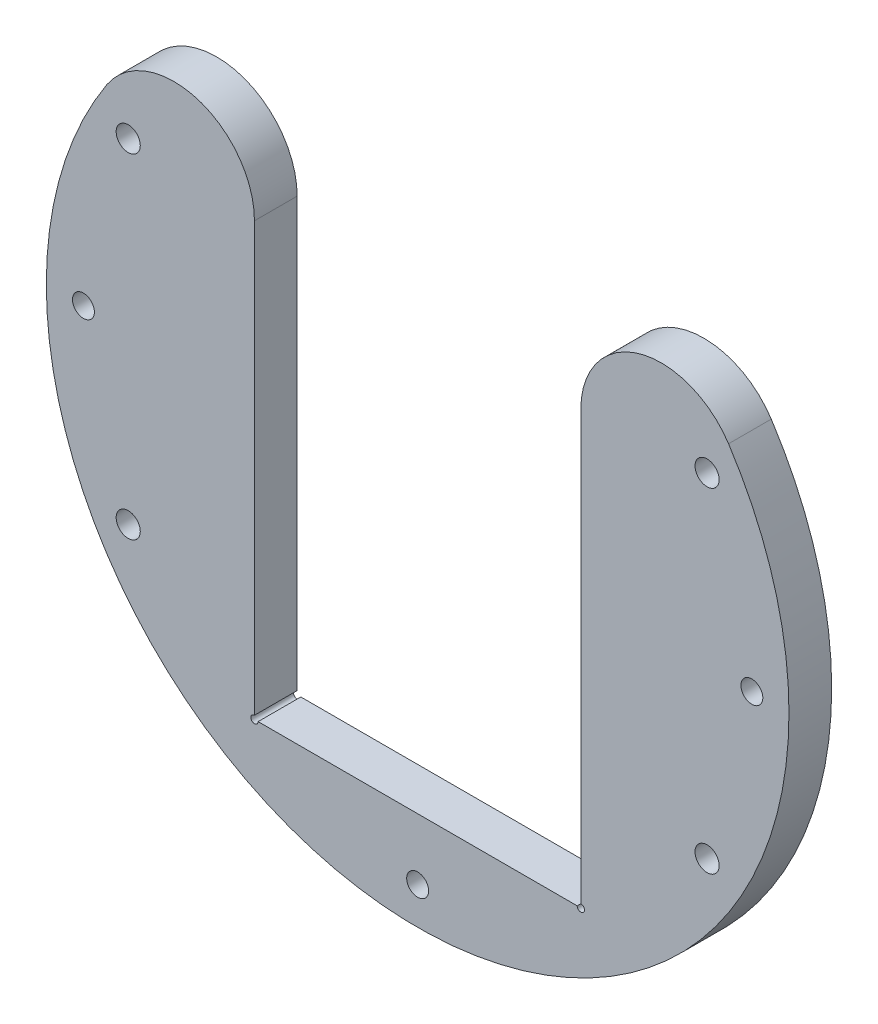
ISO-10303-21;
HEADER;
FILE_DESCRIPTION(('STEP AP214'),'2;1');
FILE_NAME('part.step','',(''),(''),'','','');
FILE_SCHEMA(('AUTOMOTIVE_DESIGN { 1 0 10303 214 1 1 1 1 }'));
ENDSEC;
DATA;
#1=APPLICATION_CONTEXT('core data for automotive mechanical design processes');
#2=APPLICATION_PROTOCOL_DEFINITION('international standard','automotive_design',2000,#1);
#3=PRODUCT_CONTEXT('',#1,'mechanical');
#4=PRODUCT('Part','Part','',(#3));
#5=PRODUCT_RELATED_PRODUCT_CATEGORY('part','',(#4));
#6=PRODUCT_DEFINITION_FORMATION('','',#4);
#7=PRODUCT_DEFINITION_CONTEXT('part definition',#1,'design');
#8=PRODUCT_DEFINITION('design','',#6,#7);
#9=PRODUCT_DEFINITION_SHAPE('','',#8);
#10=(LENGTH_UNIT() NAMED_UNIT(*) SI_UNIT(.MILLI.,.METRE.));
#11=(NAMED_UNIT(*) PLANE_ANGLE_UNIT() SI_UNIT($,.RADIAN.));
#12=(NAMED_UNIT(*) SI_UNIT($,.STERADIAN.) SOLID_ANGLE_UNIT());
#13=UNCERTAINTY_MEASURE_WITH_UNIT(LENGTH_MEASURE(1.E-05),#10,'distance_accuracy_value','');
#14=(GEOMETRIC_REPRESENTATION_CONTEXT(3) GLOBAL_UNCERTAINTY_ASSIGNED_CONTEXT((#13)) GLOBAL_UNIT_ASSIGNED_CONTEXT((#10,
#11,#12)) REPRESENTATION_CONTEXT('',''));
#15=CARTESIAN_POINT('',(0.,0.,0.));
#16=DIRECTION('',(0.,0.,1.));
#17=DIRECTION('',(1.,0.,0.));
#18=AXIS2_PLACEMENT_3D('',#15,#16,#17);
#19=CARTESIAN_POINT('',(-22.325000054,0.,5.842));
#20=DIRECTION('',(-1.,0.,0.));
#21=DIRECTION('',(0.,-1.,0.));
#22=AXIS2_PLACEMENT_3D('',#19,#20,#21);
#23=PLANE('',#22);
#24=DIRECTION('',(0.,1.,0.));
#25=VECTOR('',#24,1.);
#26=CARTESIAN_POINT('',(-22.325000054,0.,5.842));
#27=LINE('',#26,#25);
#28=CARTESIAN_POINT('',(-22.325000054,-36.823,5.842));
#29=VERTEX_POINT('',#28);
#30=CARTESIAN_POINT('',(-22.325000054,21.759696031905,5.842));
#31=VERTEX_POINT('',#30);
#32=EDGE_CURVE('E149',#29,#31,#27,.T.);
#33=ORIENTED_EDGE('',*,*,#32,.F.);
#34=DIRECTION('',(0.,0.,1.));
#35=VECTOR('',#34,1.);
#36=CARTESIAN_POINT('',(-22.325000054,-36.823,0.));
#37=LINE('',#36,#35);
#38=CARTESIAN_POINT('',(-22.325000054,-36.823,0.));
#39=VERTEX_POINT('',#38);
#40=EDGE_CURVE('E178',#29,#39,#37,.F.);
#41=ORIENTED_EDGE('',*,*,#40,.T.);
#42=DIRECTION('',(0.,1.,0.));
#43=VECTOR('',#42,1.);
#44=CARTESIAN_POINT('',(-22.325000054,0.,0.));
#45=LINE('',#44,#43);
#46=CARTESIAN_POINT('',(-22.325000054,21.759696031905,0.));
#47=VERTEX_POINT('',#46);
#48=EDGE_CURVE('E150',#39,#47,#45,.T.);
#49=ORIENTED_EDGE('',*,*,#48,.T.);
#50=DIRECTION('',(0.,0.,-1.));
#51=VECTOR('',#50,1.);
#52=CARTESIAN_POINT('',(-22.325000054,21.759696031905,5.842));
#53=LINE('',#52,#51);
#54=EDGE_CURVE('E142',#47,#31,#53,.F.);
#55=ORIENTED_EDGE('',*,*,#54,.T.);
#56=EDGE_LOOP('',(#33,#41,#49,#55));
#57=FACE_BOUND('',#56,.T.);
#58=ADVANCED_FACE('F35',(#57),#23,.F.);
#59=CARTESIAN_POINT('',(0.,0.,5.842));
#60=DIRECTION('',(0.,0.,-1.));
#61=DIRECTION('',(-1.,0.,0.));
#62=AXIS2_PLACEMENT_3D('',#59,#60,#61);
#63=CYLINDRICAL_SURFACE('',#62,50.8);
#64=CARTESIAN_POINT('',(0.,0.,0.));
#65=DIRECTION('',(0.,0.,1.));
#66=DIRECTION('',(1.,0.,0.));
#67=AXIS2_PLACEMENT_3D('',#64,#65,#66);
#68=CIRCLE('',#67,50.8);
#69=CARTESIAN_POINT('',(-42.535427204603,27.7736823723812,0.));
#70=VERTEX_POINT('',#69);
#71=CARTESIAN_POINT('',(42.535427204603,27.7736823723812,0.));
#72=VERTEX_POINT('',#71);
#73=EDGE_CURVE('E120',#70,#72,#68,.T.);
#74=ORIENTED_EDGE('',*,*,#73,.T.);
#75=DIRECTION('',(0.,0.,-1.));
#76=VECTOR('',#75,1.);
#77=CARTESIAN_POINT('',(42.535427204603,27.7736823723812,5.842));
#78=LINE('',#77,#76);
#79=CARTESIAN_POINT('',(42.535427204603,27.7736823723812,5.842));
#80=VERTEX_POINT('',#79);
#81=EDGE_CURVE('E135',#72,#80,#78,.F.);
#82=ORIENTED_EDGE('',*,*,#81,.T.);
#83=CARTESIAN_POINT('',(0.,0.,5.842));
#84=DIRECTION('',(0.,0.,1.));
#85=DIRECTION('',(1.,0.,0.));
#86=AXIS2_PLACEMENT_3D('',#83,#84,#85);
#87=CIRCLE('',#86,50.8);
#88=CARTESIAN_POINT('',(-42.535427204603,27.7736823723812,5.842));
#89=VERTEX_POINT('',#88);
#90=EDGE_CURVE('E158',#89,#80,#87,.T.);
#91=ORIENTED_EDGE('',*,*,#90,.F.);
#92=DIRECTION('',(0.,0.,-1.));
#93=VECTOR('',#92,1.);
#94=CARTESIAN_POINT('',(-42.535427204603,27.7736823723812,5.842));
#95=LINE('',#94,#93);
#96=EDGE_CURVE('E132',#89,#70,#95,.T.);
#97=ORIENTED_EDGE('',*,*,#96,.T.);
#98=EDGE_LOOP('',(#74,#82,#91,#97));
#99=FACE_BOUND('',#98,.T.);
#100=ADVANCED_FACE('F163',(#99),#63,.T.);
#101=CARTESIAN_POINT('',(22.325000054,0.,5.842));
#102=DIRECTION('',(-1.,0.,0.));
#103=DIRECTION('',(0.,-1.,0.));
#104=AXIS2_PLACEMENT_3D('',#101,#102,#103);
#105=PLANE('',#104);
#106=DIRECTION('',(0.,0.,1.));
#107=VECTOR('',#106,1.);
#108=CARTESIAN_POINT('',(22.325000054,-36.823,0.));
#109=LINE('',#108,#107);
#110=CARTESIAN_POINT('',(22.325000054,-36.823,5.842));
#111=VERTEX_POINT('',#110);
#112=CARTESIAN_POINT('',(22.325000054,-36.823,0.));
#113=VERTEX_POINT('',#112);
#114=EDGE_CURVE('E50',#111,#113,#109,.F.);
#115=ORIENTED_EDGE('',*,*,#114,.F.);
#116=DIRECTION('',(0.,1.,0.));
#117=VECTOR('',#116,1.);
#118=CARTESIAN_POINT('',(22.325000054,0.,5.842));
#119=LINE('',#118,#117);
#120=CARTESIAN_POINT('',(22.325000054,21.7596960319049,5.842));
#121=VERTEX_POINT('',#120);
#122=EDGE_CURVE('E166',#111,#121,#119,.T.);
#123=ORIENTED_EDGE('',*,*,#122,.T.);
#124=DIRECTION('',(0.,0.,1.));
#125=VECTOR('',#124,1.);
#126=CARTESIAN_POINT('',(22.325000054,21.7596960319049,0.));
#127=LINE('',#126,#125);
#128=CARTESIAN_POINT('',(22.325000054,21.7596960319049,0.));
#129=VERTEX_POINT('',#128);
#130=EDGE_CURVE('E124',#121,#129,#127,.F.);
#131=ORIENTED_EDGE('',*,*,#130,.T.);
#132=DIRECTION('',(0.,1.,0.));
#133=VECTOR('',#132,1.);
#134=CARTESIAN_POINT('',(22.325000054,0.,0.));
#135=LINE('',#134,#133);
#136=EDGE_CURVE('E115',#113,#129,#135,.T.);
#137=ORIENTED_EDGE('',*,*,#136,.F.);
#138=EDGE_LOOP('',(#115,#123,#131,#137));
#139=FACE_BOUND('',#138,.T.);
#140=ADVANCED_FACE('F202',(#139),#105,.T.);
#141=CARTESIAN_POINT('',(-45.72,0.,5.842));
#142=DIRECTION('',(0.,0.,-1.));
#143=DIRECTION('',(-1.,0.,0.));
#144=AXIS2_PLACEMENT_3D('',#141,#142,#143);
#145=CYLINDRICAL_SURFACE('',#144,1.5);
#146=CARTESIAN_POINT('',(-45.72,0.,5.842));
#147=DIRECTION('',(0.,0.,1.));
#148=DIRECTION('',(1.,0.,0.));
#149=AXIS2_PLACEMENT_3D('',#146,#147,#148);
#150=CIRCLE('',#149,1.5);
#151=CARTESIAN_POINT('',(-44.22,0.,5.842));
#152=VERTEX_POINT('',#151);
#153=EDGE_CURVE('E169',#152,#152,#150,.T.);
#154=ORIENTED_EDGE('',*,*,#153,.T.);
#155=EDGE_LOOP('',(#154));
#156=FACE_BOUND('',#155,.T.);
#157=CARTESIAN_POINT('',(-45.72,0.,0.));
#158=DIRECTION('',(0.,0.,1.));
#159=DIRECTION('',(1.,0.,0.));
#160=AXIS2_PLACEMENT_3D('',#157,#158,#159);
#161=CIRCLE('',#160,1.5);
#162=CARTESIAN_POINT('',(-44.22,0.,0.));
#163=VERTEX_POINT('',#162);
#164=EDGE_CURVE('E193',#163,#163,#161,.T.);
#165=ORIENTED_EDGE('',*,*,#164,.F.);
#166=EDGE_LOOP('',(#165));
#167=FACE_BOUND('',#166,.T.);
#168=ADVANCED_FACE('F226',(#156,#167),#145,.F.);
#169=CARTESIAN_POINT('',(45.72,0.,5.842));
#170=DIRECTION('',(0.,0.,-1.));
#171=DIRECTION('',(-1.,0.,0.));
#172=AXIS2_PLACEMENT_3D('',#169,#170,#171);
#173=CYLINDRICAL_SURFACE('',#172,1.5);
#174=CARTESIAN_POINT('',(45.72,0.,5.842));
#175=DIRECTION('',(0.,0.,1.));
#176=DIRECTION('',(1.,0.,0.));
#177=AXIS2_PLACEMENT_3D('',#174,#175,#176);
#178=CIRCLE('',#177,1.5);
#179=CARTESIAN_POINT('',(47.22,0.,5.842));
#180=VERTEX_POINT('',#179);
#181=EDGE_CURVE('E221',#180,#180,#178,.T.);
#182=ORIENTED_EDGE('',*,*,#181,.T.);
#183=EDGE_LOOP('',(#182));
#184=FACE_BOUND('',#183,.T.);
#185=CARTESIAN_POINT('',(45.72,0.,0.));
#186=DIRECTION('',(0.,0.,1.));
#187=DIRECTION('',(1.,0.,0.));
#188=AXIS2_PLACEMENT_3D('',#185,#186,#187);
#189=CIRCLE('',#188,1.5);
#190=CARTESIAN_POINT('',(47.22,0.,0.));
#191=VERTEX_POINT('',#190);
#192=EDGE_CURVE('E190',#191,#191,#189,.T.);
#193=ORIENTED_EDGE('',*,*,#192,.F.);
#194=EDGE_LOOP('',(#193));
#195=FACE_BOUND('',#194,.T.);
#196=ADVANCED_FACE('F250',(#184,#195),#173,.F.);
#197=CARTESIAN_POINT('',(0.,-45.72,5.842));
#198=DIRECTION('',(0.,0.,-1.));
#199=DIRECTION('',(-1.,0.,0.));
#200=AXIS2_PLACEMENT_3D('',#197,#198,#199);
#201=CYLINDRICAL_SURFACE('',#200,1.5);
#202=CARTESIAN_POINT('',(0.,-45.72,5.842));
#203=DIRECTION('',(0.,0.,1.));
#204=DIRECTION('',(1.,0.,0.));
#205=AXIS2_PLACEMENT_3D('',#202,#203,#204);
#206=CIRCLE('',#205,1.5);
#207=CARTESIAN_POINT('',(1.50000000000002,-45.72,5.842));
#208=VERTEX_POINT('',#207);
#209=EDGE_CURVE('E218',#208,#208,#206,.T.);
#210=ORIENTED_EDGE('',*,*,#209,.T.);
#211=EDGE_LOOP('',(#210));
#212=FACE_BOUND('',#211,.T.);
#213=CARTESIAN_POINT('',(0.,-45.72,0.));
#214=DIRECTION('',(0.,0.,1.));
#215=DIRECTION('',(1.,0.,0.));
#216=AXIS2_PLACEMENT_3D('',#213,#214,#215);
#217=CIRCLE('',#216,1.5);
#218=CARTESIAN_POINT('',(1.50000000000002,-45.72,0.));
#219=VERTEX_POINT('',#218);
#220=EDGE_CURVE('E187',#219,#219,#217,.T.);
#221=ORIENTED_EDGE('',*,*,#220,.F.);
#222=EDGE_LOOP('',(#221));
#223=FACE_BOUND('',#222,.T.);
#224=ADVANCED_FACE('F253',(#212,#223),#201,.F.);
#225=CARTESIAN_POINT('',(39.5946814610245,22.86,5.842));
#226=DIRECTION('',(0.,0.,-1.));
#227=DIRECTION('',(-1.,0.,0.));
#228=AXIS2_PLACEMENT_3D('',#225,#226,#227);
#229=CYLINDRICAL_SURFACE('',#228,1.65);
#230=CARTESIAN_POINT('',(39.5946814610245,22.86,5.842));
#231=DIRECTION('',(0.,0.,1.));
#232=DIRECTION('',(1.,0.,0.));
#233=AXIS2_PLACEMENT_3D('',#230,#231,#232);
#234=CIRCLE('',#233,1.65);
#235=CARTESIAN_POINT('',(41.2446814610245,22.86,5.842));
#236=VERTEX_POINT('',#235);
#237=EDGE_CURVE('E215',#236,#236,#234,.T.);
#238=ORIENTED_EDGE('',*,*,#237,.T.);
#239=EDGE_LOOP('',(#238));
#240=FACE_BOUND('',#239,.T.);
#241=CARTESIAN_POINT('',(39.5946814610245,22.86,0.));
#242=DIRECTION('',(0.,0.,1.));
#243=DIRECTION('',(1.,0.,0.));
#244=AXIS2_PLACEMENT_3D('',#241,#242,#243);
#245=CIRCLE('',#244,1.65);
#246=CARTESIAN_POINT('',(41.2446814610245,22.86,0.));
#247=VERTEX_POINT('',#246);
#248=EDGE_CURVE('E184',#247,#247,#245,.T.);
#249=ORIENTED_EDGE('',*,*,#248,.F.);
#250=EDGE_LOOP('',(#249));
#251=FACE_BOUND('',#250,.T.);
#252=ADVANCED_FACE('F257',(#240,#251),#229,.F.);
#253=CARTESIAN_POINT('',(39.5946814610245,-22.86,5.842));
#254=DIRECTION('',(0.,0.,-1.));
#255=DIRECTION('',(-1.,0.,0.));
#256=AXIS2_PLACEMENT_3D('',#253,#254,#255);
#257=CYLINDRICAL_SURFACE('',#256,1.65);
#258=CARTESIAN_POINT('',(39.5946814610245,-22.86,5.842));
#259=DIRECTION('',(0.,0.,1.));
#260=DIRECTION('',(1.,0.,0.));
#261=AXIS2_PLACEMENT_3D('',#258,#259,#260);
#262=CIRCLE('',#261,1.65);
#263=CARTESIAN_POINT('',(41.2446814610245,-22.86,5.842));
#264=VERTEX_POINT('',#263);
#265=EDGE_CURVE('E212',#264,#264,#262,.T.);
#266=ORIENTED_EDGE('',*,*,#265,.T.);
#267=EDGE_LOOP('',(#266));
#268=FACE_BOUND('',#267,.T.);
#269=CARTESIAN_POINT('',(39.5946814610245,-22.86,0.));
#270=DIRECTION('',(0.,0.,1.));
#271=DIRECTION('',(1.,0.,0.));
#272=AXIS2_PLACEMENT_3D('',#269,#270,#271);
#273=CIRCLE('',#272,1.65);
#274=CARTESIAN_POINT('',(41.2446814610245,-22.86,0.));
#275=VERTEX_POINT('',#274);
#276=EDGE_CURVE('E181',#275,#275,#273,.T.);
#277=ORIENTED_EDGE('',*,*,#276,.F.);
#278=EDGE_LOOP('',(#277));
#279=FACE_BOUND('',#278,.T.);
#280=ADVANCED_FACE('F261',(#268,#279),#257,.F.);
#281=CARTESIAN_POINT('',(-39.5946814610245,-22.86,5.842));
#282=DIRECTION('',(0.,0.,-1.));
#283=DIRECTION('',(-1.,0.,0.));
#284=AXIS2_PLACEMENT_3D('',#281,#282,#283);
#285=CYLINDRICAL_SURFACE('',#284,1.65);
#286=CARTESIAN_POINT('',(-39.5946814610245,-22.86,5.842));
#287=DIRECTION('',(0.,0.,1.));
#288=DIRECTION('',(1.,0.,0.));
#289=AXIS2_PLACEMENT_3D('',#286,#287,#288);
#290=CIRCLE('',#289,1.65);
#291=CARTESIAN_POINT('',(-37.9446814610245,-22.86,5.842));
#292=VERTEX_POINT('',#291);
#293=EDGE_CURVE('E118',#292,#292,#290,.T.);
#294=ORIENTED_EDGE('',*,*,#293,.T.);
#295=EDGE_LOOP('',(#294));
#296=FACE_BOUND('',#295,.T.);
#297=CARTESIAN_POINT('',(-39.5946814610245,-22.86,0.));
#298=DIRECTION('',(0.,0.,1.));
#299=DIRECTION('',(1.,0.,0.));
#300=AXIS2_PLACEMENT_3D('',#297,#298,#299);
#301=CIRCLE('',#300,1.65);
#302=CARTESIAN_POINT('',(-37.9446814610245,-22.86,0.));
#303=VERTEX_POINT('',#302);
#304=EDGE_CURVE('E177',#303,#303,#301,.T.);
#305=ORIENTED_EDGE('',*,*,#304,.F.);
#306=EDGE_LOOP('',(#305));
#307=FACE_BOUND('',#306,.T.);
#308=ADVANCED_FACE('F265',(#296,#307),#285,.F.);
#309=CARTESIAN_POINT('',(-39.5946814610245,22.86,5.842));
#310=DIRECTION('',(0.,0.,-1.));
#311=DIRECTION('',(-1.,0.,0.));
#312=AXIS2_PLACEMENT_3D('',#309,#310,#311);
#313=CYLINDRICAL_SURFACE('',#312,1.65);
#314=CARTESIAN_POINT('',(-39.5946814610245,22.86,5.842));
#315=DIRECTION('',(0.,0.,1.));
#316=DIRECTION('',(1.,0.,0.));
#317=AXIS2_PLACEMENT_3D('',#314,#315,#316);
#318=CIRCLE('',#317,1.65);
#319=CARTESIAN_POINT('',(-37.9446814610246,22.86,5.842));
#320=VERTEX_POINT('',#319);
#321=EDGE_CURVE('E114',#320,#320,#318,.T.);
#322=ORIENTED_EDGE('',*,*,#321,.T.);
#323=EDGE_LOOP('',(#322));
#324=FACE_BOUND('',#323,.T.);
#325=CARTESIAN_POINT('',(-39.5946814610245,22.86,0.));
#326=DIRECTION('',(0.,0.,1.));
#327=DIRECTION('',(1.,0.,0.));
#328=AXIS2_PLACEMENT_3D('',#325,#326,#327);
#329=CIRCLE('',#328,1.65);
#330=CARTESIAN_POINT('',(-37.9446814610246,22.86,0.));
#331=VERTEX_POINT('',#330);
#332=EDGE_CURVE('E174',#331,#331,#329,.T.);
#333=ORIENTED_EDGE('',*,*,#332,.F.);
#334=EDGE_LOOP('',(#333));
#335=FACE_BOUND('',#334,.T.);
#336=ADVANCED_FACE('F237',(#324,#335),#313,.F.);
#337=CARTESIAN_POINT('',(0.,-37.323,5.842));
#338=DIRECTION('',(0.,1.,0.));
#339=DIRECTION('',(-1.,0.,0.));
#340=AXIS2_PLACEMENT_3D('',#337,#338,#339);
#341=PLANE('',#340);
#342=DIRECTION('',(0.,0.,1.));
#343=VECTOR('',#342,1.);
#344=CARTESIAN_POINT('',(21.825000054,-37.323,0.));
#345=LINE('',#344,#343);
#346=CARTESIAN_POINT('',(21.825000054,-37.323,0.));
#347=VERTEX_POINT('',#346);
#348=CARTESIAN_POINT('',(21.825000054,-37.323,5.842));
#349=VERTEX_POINT('',#348);
#350=EDGE_CURVE('E98',#347,#349,#345,.T.);
#351=ORIENTED_EDGE('',*,*,#350,.F.);
#352=DIRECTION('',(1.,0.,0.));
#353=VECTOR('',#352,1.);
#354=CARTESIAN_POINT('',(0.,-37.323,0.));
#355=LINE('',#354,#353);
#356=CARTESIAN_POINT('',(-21.825000054,-37.323,0.));
#357=VERTEX_POINT('',#356);
#358=EDGE_CURVE('E107',#357,#347,#355,.T.);
#359=ORIENTED_EDGE('',*,*,#358,.F.);
#360=DIRECTION('',(0.,0.,1.));
#361=VECTOR('',#360,1.);
#362=CARTESIAN_POINT('',(-21.825000054,-37.323,0.));
#363=LINE('',#362,#361);
#364=CARTESIAN_POINT('',(-21.825000054,-37.323,5.842));
#365=VERTEX_POINT('',#364);
#366=EDGE_CURVE('E57',#365,#357,#363,.F.);
#367=ORIENTED_EDGE('',*,*,#366,.F.);
#368=DIRECTION('',(1.,0.,0.));
#369=VECTOR('',#368,1.);
#370=CARTESIAN_POINT('',(0.,-37.323,5.842));
#371=LINE('',#370,#369);
#372=EDGE_CURVE('E109',#365,#349,#371,.T.);
#373=ORIENTED_EDGE('',*,*,#372,.T.);
#374=EDGE_LOOP('',(#351,#359,#367,#373));
#375=FACE_BOUND('',#374,.T.);
#376=ADVANCED_FACE('F106',(#375),#341,.T.);
#377=CARTESIAN_POINT('',(0.,0.,5.842));
#378=DIRECTION('',(0.,0.,1.));
#379=DIRECTION('',(1.,0.,0.));
#380=AXIS2_PLACEMENT_3D('',#377,#378,#379);
#381=PLANE('',#380);
#382=CARTESIAN_POINT('',(22.325000054,-37.323,5.842));
#383=DIRECTION('',(0.,0.,1.));
#384=DIRECTION('',(1.,0.,0.));
#385=AXIS2_PLACEMENT_3D('',#382,#383,#384);
#386=CIRCLE('',#385,0.499999999999999);
#387=EDGE_CURVE('E110',#349,#111,#386,.T.);
#388=ORIENTED_EDGE('',*,*,#387,.F.);
#389=ORIENTED_EDGE('',*,*,#372,.F.);
#390=CARTESIAN_POINT('',(-22.325000054,-37.323,5.842));
#391=DIRECTION('',(0.,0.,1.));
#392=DIRECTION('',(1.,0.,0.));
#393=AXIS2_PLACEMENT_3D('',#390,#391,#392);
#394=CIRCLE('',#393,0.499999999999999);
#395=EDGE_CURVE('E203',#29,#365,#394,.T.);
#396=ORIENTED_EDGE('',*,*,#395,.F.);
#397=ORIENTED_EDGE('',*,*,#32,.T.);
#398=CARTESIAN_POINT('',(-33.325000054,21.759696031905,5.842));
#399=DIRECTION('',(0.,0.,1.));
#400=DIRECTION('',(1.,0.,0.));
#401=AXIS2_PLACEMENT_3D('',#398,#399,#400);
#402=CIRCLE('',#401,11.);
#403=EDGE_CURVE('E137',#31,#89,#402,.T.);
#404=ORIENTED_EDGE('',*,*,#403,.T.);
#405=ORIENTED_EDGE('',*,*,#90,.T.);
#406=CARTESIAN_POINT('',(33.325000054,21.7596960319049,5.842));
#407=DIRECTION('',(0.,0.,1.));
#408=DIRECTION('',(1.,0.,0.));
#409=AXIS2_PLACEMENT_3D('',#406,#407,#408);
#410=CIRCLE('',#409,11.);
#411=EDGE_CURVE('E139',#80,#121,#410,.T.);
#412=ORIENTED_EDGE('',*,*,#411,.T.);
#413=ORIENTED_EDGE('',*,*,#122,.F.);
#414=EDGE_LOOP('',(#388,#389,#396,#397,#404,#405,#412,#413));
#415=FACE_BOUND('',#414,.T.);
#416=ORIENTED_EDGE('',*,*,#321,.F.);
#417=EDGE_LOOP('',(#416));
#418=FACE_BOUND('',#417,.T.);
#419=ORIENTED_EDGE('',*,*,#293,.F.);
#420=EDGE_LOOP('',(#419));
#421=FACE_BOUND('',#420,.T.);
#422=ORIENTED_EDGE('',*,*,#265,.F.);
#423=EDGE_LOOP('',(#422));
#424=FACE_BOUND('',#423,.T.);
#425=ORIENTED_EDGE('',*,*,#237,.F.);
#426=EDGE_LOOP('',(#425));
#427=FACE_BOUND('',#426,.T.);
#428=ORIENTED_EDGE('',*,*,#209,.F.);
#429=EDGE_LOOP('',(#428));
#430=FACE_BOUND('',#429,.T.);
#431=ORIENTED_EDGE('',*,*,#181,.F.);
#432=EDGE_LOOP('',(#431));
#433=FACE_BOUND('',#432,.T.);
#434=ORIENTED_EDGE('',*,*,#153,.F.);
#435=EDGE_LOOP('',(#434));
#436=FACE_BOUND('',#435,.T.);
#437=ADVANCED_FACE('F156',(#415,#418,#421,#424,#427,#430,#433,#436),#381,.T.);
#438=CARTESIAN_POINT('',(0.,0.,0.));
#439=DIRECTION('',(0.,0.,1.));
#440=DIRECTION('',(1.,0.,0.));
#441=AXIS2_PLACEMENT_3D('',#438,#439,#440);
#442=PLANE('',#441);
#443=ORIENTED_EDGE('',*,*,#332,.T.);
#444=EDGE_LOOP('',(#443));
#445=FACE_BOUND('',#444,.T.);
#446=ORIENTED_EDGE('',*,*,#304,.T.);
#447=EDGE_LOOP('',(#446));
#448=FACE_BOUND('',#447,.T.);
#449=ORIENTED_EDGE('',*,*,#276,.T.);
#450=EDGE_LOOP('',(#449));
#451=FACE_BOUND('',#450,.T.);
#452=ORIENTED_EDGE('',*,*,#248,.T.);
#453=EDGE_LOOP('',(#452));
#454=FACE_BOUND('',#453,.T.);
#455=ORIENTED_EDGE('',*,*,#220,.T.);
#456=EDGE_LOOP('',(#455));
#457=FACE_BOUND('',#456,.T.);
#458=ORIENTED_EDGE('',*,*,#192,.T.);
#459=EDGE_LOOP('',(#458));
#460=FACE_BOUND('',#459,.T.);
#461=ORIENTED_EDGE('',*,*,#164,.T.);
#462=EDGE_LOOP('',(#461));
#463=FACE_BOUND('',#462,.T.);
#464=ORIENTED_EDGE('',*,*,#358,.T.);
#465=CARTESIAN_POINT('',(22.325000054,-37.323,0.));
#466=DIRECTION('',(0.,0.,1.));
#467=DIRECTION('',(1.,0.,0.));
#468=AXIS2_PLACEMENT_3D('',#465,#466,#467);
#469=CIRCLE('',#468,0.499999999999999);
#470=EDGE_CURVE('E11',#347,#113,#469,.T.);
#471=ORIENTED_EDGE('',*,*,#470,.T.);
#472=ORIENTED_EDGE('',*,*,#136,.T.);
#473=CARTESIAN_POINT('',(33.325000054,21.7596960319049,0.));
#474=DIRECTION('',(0.,0.,1.));
#475=DIRECTION('',(1.,0.,0.));
#476=AXIS2_PLACEMENT_3D('',#473,#474,#475);
#477=CIRCLE('',#476,11.);
#478=EDGE_CURVE('E130',#129,#72,#477,.F.);
#479=ORIENTED_EDGE('',*,*,#478,.T.);
#480=ORIENTED_EDGE('',*,*,#73,.F.);
#481=CARTESIAN_POINT('',(-33.325000054,21.759696031905,0.));
#482=DIRECTION('',(0.,0.,1.));
#483=DIRECTION('',(1.,0.,0.));
#484=AXIS2_PLACEMENT_3D('',#481,#482,#483);
#485=CIRCLE('',#484,11.);
#486=EDGE_CURVE('E127',#70,#47,#485,.F.);
#487=ORIENTED_EDGE('',*,*,#486,.T.);
#488=ORIENTED_EDGE('',*,*,#48,.F.);
#489=CARTESIAN_POINT('',(-22.325000054,-37.323,0.));
#490=DIRECTION('',(0.,0.,1.));
#491=DIRECTION('',(1.,0.,0.));
#492=AXIS2_PLACEMENT_3D('',#489,#490,#491);
#493=CIRCLE('',#492,0.499999999999999);
#494=EDGE_CURVE('E43',#39,#357,#493,.T.);
#495=ORIENTED_EDGE('',*,*,#494,.T.);
#496=EDGE_LOOP('',(#464,#471,#472,#479,#480,#487,#488,#495));
#497=FACE_BOUND('',#496,.T.);
#498=ADVANCED_FACE('F112',(#445,#448,#451,#454,#457,#460,#463,#497),#442,.F.);
#499=CARTESIAN_POINT('',(33.325000054,21.7596960319049,5.842));
#500=DIRECTION('',(0.,0.,-1.));
#501=DIRECTION('',(-1.,0.,0.));
#502=AXIS2_PLACEMENT_3D('',#499,#500,#501);
#503=CYLINDRICAL_SURFACE('',#502,11.);
#504=ORIENTED_EDGE('',*,*,#411,.F.);
#505=ORIENTED_EDGE('',*,*,#81,.F.);
#506=ORIENTED_EDGE('',*,*,#478,.F.);
#507=ORIENTED_EDGE('',*,*,#130,.F.);
#508=EDGE_LOOP('',(#504,#505,#506,#507));
#509=FACE_BOUND('',#508,.T.);
#510=ADVANCED_FACE('F198',(#509),#503,.T.);
#511=CARTESIAN_POINT('',(-33.325000054,21.759696031905,5.842));
#512=DIRECTION('',(0.,0.,-1.));
#513=DIRECTION('',(-1.,0.,0.));
#514=AXIS2_PLACEMENT_3D('',#511,#512,#513);
#515=CYLINDRICAL_SURFACE('',#514,11.);
#516=ORIENTED_EDGE('',*,*,#403,.F.);
#517=ORIENTED_EDGE('',*,*,#54,.F.);
#518=ORIENTED_EDGE('',*,*,#486,.F.);
#519=ORIENTED_EDGE('',*,*,#96,.F.);
#520=EDGE_LOOP('',(#516,#517,#518,#519));
#521=FACE_BOUND('',#520,.T.);
#522=ADVANCED_FACE('F37',(#521),#515,.T.);
#523=CARTESIAN_POINT('',(-22.325000054,-37.323,0.));
#524=DIRECTION('',(0.,0.,1.));
#525=DIRECTION('',(1.,0.,0.));
#526=AXIS2_PLACEMENT_3D('',#523,#524,#525);
#527=CYLINDRICAL_SURFACE('',#526,0.499999999999999);
#528=ORIENTED_EDGE('',*,*,#395,.T.);
#529=ORIENTED_EDGE('',*,*,#366,.T.);
#530=ORIENTED_EDGE('',*,*,#494,.F.);
#531=ORIENTED_EDGE('',*,*,#40,.F.);
#532=EDGE_LOOP('',(#528,#529,#530,#531));
#533=FACE_BOUND('',#532,.T.);
#534=ADVANCED_FACE('F276',(#533),#527,.F.);
#535=CARTESIAN_POINT('',(22.325000054,-37.323,0.));
#536=DIRECTION('',(0.,0.,1.));
#537=DIRECTION('',(1.,0.,0.));
#538=AXIS2_PLACEMENT_3D('',#535,#536,#537);
#539=CYLINDRICAL_SURFACE('',#538,0.499999999999999);
#540=ORIENTED_EDGE('',*,*,#114,.T.);
#541=ORIENTED_EDGE('',*,*,#470,.F.);
#542=ORIENTED_EDGE('',*,*,#350,.T.);
#543=ORIENTED_EDGE('',*,*,#387,.T.);
#544=EDGE_LOOP('',(#540,#541,#542,#543));
#545=FACE_BOUND('',#544,.T.);
#546=ADVANCED_FACE('F97',(#545),#539,.F.);
#547=CLOSED_SHELL('',(#58,#100,#140,#168,#196,#224,#252,#280,#308,#336,#376,#437,#498,#510,#522,
#534,#546));
#548=MANIFOLD_SOLID_BREP('B2',#547);
#549=ADVANCED_BREP_SHAPE_REPRESENTATION('',(#18,#548),#14);
#550=SHAPE_DEFINITION_REPRESENTATION(#9,#549);
ENDSEC;
END-ISO-10303-21;
